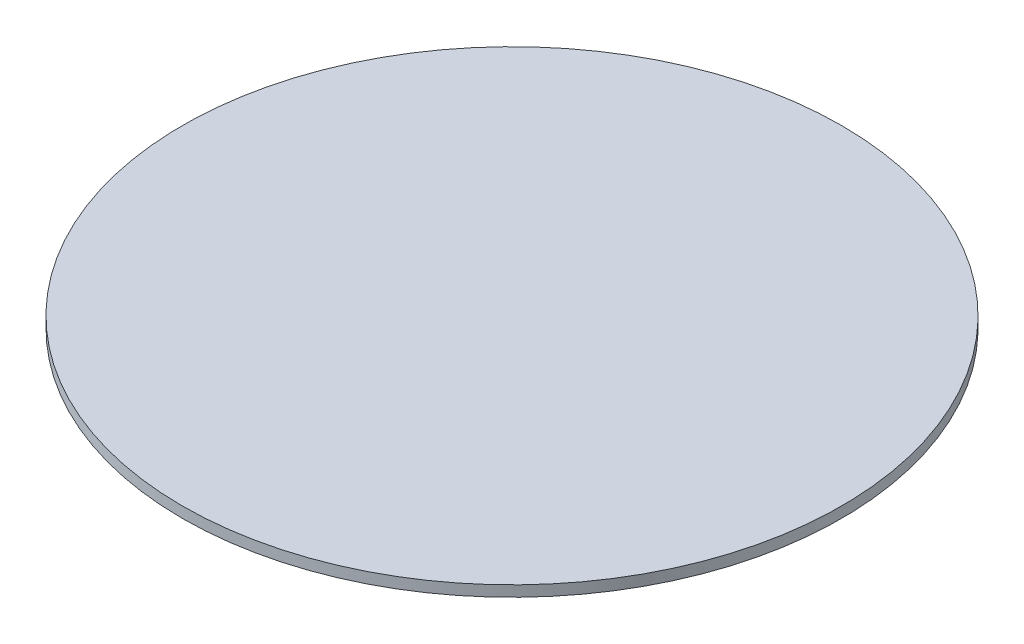
ISO-10303-21;
HEADER;
FILE_DESCRIPTION(('STEP AP214'),'2;1');
FILE_NAME('part.step','',(''),(''),'','','');
FILE_SCHEMA(('AUTOMOTIVE_DESIGN { 1 0 10303 214 1 1 1 1 }'));
ENDSEC;
DATA;
#1=APPLICATION_CONTEXT('core data for automotive mechanical design processes');
#2=APPLICATION_PROTOCOL_DEFINITION('international standard','automotive_design',2000,#1);
#3=PRODUCT_CONTEXT('',#1,'mechanical');
#4=PRODUCT('Part','Part','',(#3));
#5=PRODUCT_RELATED_PRODUCT_CATEGORY('part','',(#4));
#6=PRODUCT_DEFINITION_FORMATION('','',#4);
#7=PRODUCT_DEFINITION_CONTEXT('part definition',#1,'design');
#8=PRODUCT_DEFINITION('design','',#6,#7);
#9=PRODUCT_DEFINITION_SHAPE('','',#8);
#10=(LENGTH_UNIT() NAMED_UNIT(*) SI_UNIT(.MILLI.,.METRE.));
#11=(NAMED_UNIT(*) PLANE_ANGLE_UNIT() SI_UNIT($,.RADIAN.));
#12=(NAMED_UNIT(*) SI_UNIT($,.STERADIAN.) SOLID_ANGLE_UNIT());
#13=UNCERTAINTY_MEASURE_WITH_UNIT(LENGTH_MEASURE(1.E-05),#10,'distance_accuracy_value','');
#14=(GEOMETRIC_REPRESENTATION_CONTEXT(3) GLOBAL_UNCERTAINTY_ASSIGNED_CONTEXT((#13)) GLOBAL_UNIT_ASSIGNED_CONTEXT((#10,
#11,#12)) REPRESENTATION_CONTEXT('',''));
#15=CARTESIAN_POINT('',(0.,0.,0.));
#16=DIRECTION('',(0.,0.,1.));
#17=DIRECTION('',(1.,0.,0.));
#18=AXIS2_PLACEMENT_3D('',#15,#16,#17);
#19=CARTESIAN_POINT('',(0.,10.,0.));
#20=DIRECTION('',(0.,-1.,0.));
#21=DIRECTION('',(0.,0.,-1.));
#22=AXIS2_PLACEMENT_3D('',#19,#20,#21);
#23=CYLINDRICAL_SURFACE('',#22,305.);
#24=CARTESIAN_POINT('',(0.,10.,0.));
#25=DIRECTION('',(0.,1.,0.));
#26=DIRECTION('',(0.,0.,1.));
#27=AXIS2_PLACEMENT_3D('',#24,#25,#26);
#28=CIRCLE('',#27,305.);
#29=CARTESIAN_POINT('',(0.,10.,305.));
#30=VERTEX_POINT('',#29);
#31=EDGE_CURVE('E10',#30,#30,#28,.T.);
#32=ORIENTED_EDGE('',*,*,#31,.F.);
#33=EDGE_LOOP('',(#32));
#34=FACE_BOUND('',#33,.T.);
#35=CARTESIAN_POINT('',(0.,0.,0.));
#36=DIRECTION('',(0.,1.,0.));
#37=DIRECTION('',(0.,0.,1.));
#38=AXIS2_PLACEMENT_3D('',#35,#36,#37);
#39=CIRCLE('',#38,305.);
#40=CARTESIAN_POINT('',(0.,0.,305.));
#41=VERTEX_POINT('',#40);
#42=EDGE_CURVE('E34',#41,#41,#39,.T.);
#43=ORIENTED_EDGE('',*,*,#42,.T.);
#44=EDGE_LOOP('',(#43));
#45=FACE_BOUND('',#44,.T.);
#46=ADVANCED_FACE('F31',(#34,#45),#23,.T.);
#47=CARTESIAN_POINT('',(0.,10.,0.));
#48=DIRECTION('',(0.,1.,0.));
#49=DIRECTION('',(0.,0.,1.));
#50=AXIS2_PLACEMENT_3D('',#47,#48,#49);
#51=PLANE('',#50);
#52=ORIENTED_EDGE('',*,*,#31,.T.);
#53=EDGE_LOOP('',(#52));
#54=FACE_BOUND('',#53,.T.);
#55=ADVANCED_FACE('F46',(#54),#51,.T.);
#56=CARTESIAN_POINT('',(0.,0.,0.));
#57=DIRECTION('',(0.,1.,0.));
#58=DIRECTION('',(0.,0.,1.));
#59=AXIS2_PLACEMENT_3D('',#56,#57,#58);
#60=PLANE('',#59);
#61=ORIENTED_EDGE('',*,*,#42,.F.);
#62=EDGE_LOOP('',(#61));
#63=FACE_BOUND('',#62,.T.);
#64=ADVANCED_FACE('F44',(#63),#60,.F.);
#65=CLOSED_SHELL('',(#46,#55,#64));
#66=MANIFOLD_SOLID_BREP('B2',#65);
#67=ADVANCED_BREP_SHAPE_REPRESENTATION('',(#18,#66),#14);
#68=SHAPE_DEFINITION_REPRESENTATION(#9,#67);
ENDSEC;
END-ISO-10303-21;
